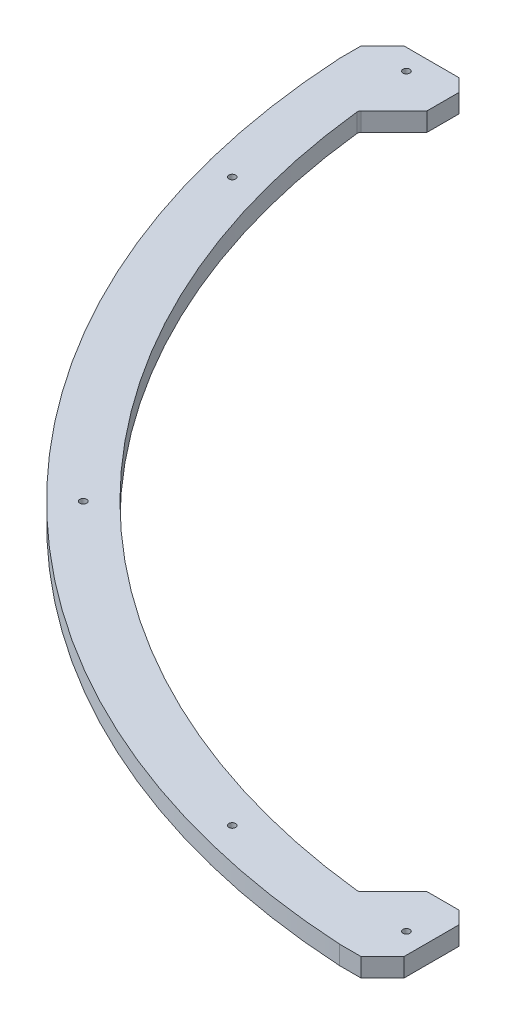
ISO-10303-21;
HEADER;
FILE_DESCRIPTION(('STEP AP214'),'2;1');
FILE_NAME('part.step','',(''),(''),'','','');
FILE_SCHEMA(('AUTOMOTIVE_DESIGN { 1 0 10303 214 1 1 1 1 }'));
ENDSEC;
DATA;
#1=APPLICATION_CONTEXT('core data for automotive mechanical design processes');
#2=APPLICATION_PROTOCOL_DEFINITION('international standard','automotive_design',2000,#1);
#3=PRODUCT_CONTEXT('',#1,'mechanical');
#4=PRODUCT('Part','Part','',(#3));
#5=PRODUCT_RELATED_PRODUCT_CATEGORY('part','',(#4));
#6=PRODUCT_DEFINITION_FORMATION('','',#4);
#7=PRODUCT_DEFINITION_CONTEXT('part definition',#1,'design');
#8=PRODUCT_DEFINITION('design','',#6,#7);
#9=PRODUCT_DEFINITION_SHAPE('','',#8);
#10=(LENGTH_UNIT() NAMED_UNIT(*) SI_UNIT(.MILLI.,.METRE.));
#11=(NAMED_UNIT(*) PLANE_ANGLE_UNIT() SI_UNIT($,.RADIAN.));
#12=(NAMED_UNIT(*) SI_UNIT($,.STERADIAN.) SOLID_ANGLE_UNIT());
#13=UNCERTAINTY_MEASURE_WITH_UNIT(LENGTH_MEASURE(1.E-05),#10,'distance_accuracy_value','');
#14=(GEOMETRIC_REPRESENTATION_CONTEXT(3) GLOBAL_UNCERTAINTY_ASSIGNED_CONTEXT((#13)) GLOBAL_UNIT_ASSIGNED_CONTEXT((#10,
#11,#12)) REPRESENTATION_CONTEXT('',''));
#15=CARTESIAN_POINT('',(0.,0.,0.));
#16=DIRECTION('',(0.,0.,1.));
#17=DIRECTION('',(1.,0.,0.));
#18=AXIS2_PLACEMENT_3D('',#15,#16,#17);
#19=CARTESIAN_POINT('',(0.,18.25625,0.));
#20=DIRECTION('',(0.,-1.,0.));
#21=DIRECTION('',(0.,0.,-1.));
#22=AXIS2_PLACEMENT_3D('',#19,#20,#21);
#23=CYLINDRICAL_SURFACE('',#22,746.125);
#24=CARTESIAN_POINT('',(0.,0.,0.));
#25=DIRECTION('',(0.,1.,0.));
#26=DIRECTION('',(0.,0.,1.));
#27=AXIS2_PLACEMENT_3D('',#24,#25,#26);
#28=CIRCLE('',#27,746.125);
#29=CARTESIAN_POINT('',(-741.694721735866,0.,81.1877784777796));
#30=VERTEX_POINT('',#29);
#31=CARTESIAN_POINT('',(-81.187778477779,0.,741.694721735866));
#32=VERTEX_POINT('',#31);
#33=EDGE_CURVE('E219',#30,#32,#28,.T.);
#34=ORIENTED_EDGE('',*,*,#33,.F.);
#35=DIRECTION('',(0.,-1.,0.));
#36=VECTOR('',#35,1.);
#37=CARTESIAN_POINT('',(-741.694721735866,18.25625,81.1877784777796));
#38=LINE('',#37,#36);
#39=CARTESIAN_POINT('',(-741.694721735866,18.25625,81.1877784777796));
#40=VERTEX_POINT('',#39);
#41=EDGE_CURVE('E237',#30,#40,#38,.F.);
#42=ORIENTED_EDGE('',*,*,#41,.T.);
#43=CARTESIAN_POINT('',(0.,18.25625,0.));
#44=DIRECTION('',(0.,1.,0.));
#45=DIRECTION('',(0.,0.,1.));
#46=AXIS2_PLACEMENT_3D('',#43,#44,#45);
#47=CIRCLE('',#46,746.125);
#48=CARTESIAN_POINT('',(-81.187778477779,18.25625,741.694721735866));
#49=VERTEX_POINT('',#48);
#50=EDGE_CURVE('E220',#40,#49,#47,.T.);
#51=ORIENTED_EDGE('',*,*,#50,.T.);
#52=DIRECTION('',(0.,-1.,0.));
#53=VECTOR('',#52,1.);
#54=CARTESIAN_POINT('',(-81.187778477779,18.25625,741.694721735866));
#55=LINE('',#54,#53);
#56=EDGE_CURVE('E235',#49,#32,#55,.T.);
#57=ORIENTED_EDGE('',*,*,#56,.T.);
#58=EDGE_LOOP('',(#34,#42,#51,#57));
#59=FACE_BOUND('',#58,.T.);
#60=ADVANCED_FACE('F47',(#59),#23,.F.);
#61=CARTESIAN_POINT('',(0.,18.25625,0.));
#62=DIRECTION('',(0.,1.,0.));
#63=DIRECTION('',(0.,0.,1.));
#64=AXIS2_PLACEMENT_3D('',#61,#62,#63);
#65=PLANE('',#64);
#66=DIRECTION('',(1.,0.,0.));
#67=VECTOR('',#66,1.);
#68=CARTESIAN_POINT('',(-774.547090442214,18.25625,2.24506403026717));
#69=LINE('',#68,#67);
#70=CARTESIAN_POINT('',(-774.547090442214,18.25625,2.24506403026717));
#71=VERTEX_POINT('',#70);
#72=CARTESIAN_POINT('',(-720.665553715799,18.25625,2.24506403026716));
#73=VERTEX_POINT('',#72);
#74=EDGE_CURVE('E169',#71,#73,#69,.T.);
#75=ORIENTED_EDGE('',*,*,#74,.F.);
#76=DIRECTION('',(-0.707106781186548,0.,0.707106781186547));
#77=VECTOR('',#76,1.);
#78=CARTESIAN_POINT('',(-949.662084803063,18.25625,177.360058391116));
#79=LINE('',#78,#77);
#80=CARTESIAN_POINT('',(-795.684392912793,18.25625,23.3823665008459));
#81=VERTEX_POINT('',#80);
#82=EDGE_CURVE('E177',#71,#81,#79,.T.);
#83=ORIENTED_EDGE('',*,*,#82,.T.);
#84=DIRECTION('',(0.,0.,-1.));
#85=VECTOR('',#84,1.);
#86=CARTESIAN_POINT('',(-795.684392912793,18.25625,44.45));
#87=LINE('',#86,#85);
#88=CARTESIAN_POINT('',(-795.684392912793,18.25625,44.45));
#89=VERTEX_POINT('',#88);
#90=EDGE_CURVE('E208',#89,#81,#87,.T.);
#91=ORIENTED_EDGE('',*,*,#90,.F.);
#92=CARTESIAN_POINT('',(0.,18.25625,0.));
#93=DIRECTION('',(0.,1.,0.));
#94=DIRECTION('',(0.,0.,1.));
#95=AXIS2_PLACEMENT_3D('',#92,#93,#94);
#96=CIRCLE('',#95,796.925);
#97=CARTESIAN_POINT('',(-44.4499999999999,18.25625,795.684392912793));
#98=VERTEX_POINT('',#97);
#99=EDGE_CURVE('E225',#89,#98,#96,.T.);
#100=ORIENTED_EDGE('',*,*,#99,.T.);
#101=DIRECTION('',(-1.,0.,0.));
#102=VECTOR('',#101,1.);
#103=CARTESIAN_POINT('',(-44.4499999999999,18.25625,795.684392912793));
#104=LINE('',#103,#102);
#105=CARTESIAN_POINT('',(-23.3823665008462,18.25625,795.684392912793));
#106=VERTEX_POINT('',#105);
#107=EDGE_CURVE('E203',#106,#98,#104,.T.);
#108=ORIENTED_EDGE('',*,*,#107,.F.);
#109=DIRECTION('',(0.707106781186547,0.,-0.707106781186548));
#110=VECTOR('',#109,1.);
#111=CARTESIAN_POINT('',(-177.360058391116,18.25625,949.662084803063));
#112=LINE('',#111,#110);
#113=CARTESIAN_POINT('',(-2.24506403026659,18.25625,774.547090442214));
#114=VERTEX_POINT('',#113);
#115=EDGE_CURVE('E183',#106,#114,#112,.T.);
#116=ORIENTED_EDGE('',*,*,#115,.T.);
#117=DIRECTION('',(0.,0.,1.));
#118=VECTOR('',#117,1.);
#119=CARTESIAN_POINT('',(-2.24506403026659,18.25625,774.547090442214));
#120=LINE('',#119,#118);
#121=CARTESIAN_POINT('',(-2.24506403026725,18.25625,720.665553715799));
#122=VERTEX_POINT('',#121);
#123=EDGE_CURVE('E283',#122,#114,#120,.T.);
#124=ORIENTED_EDGE('',*,*,#123,.F.);
#125=DIRECTION('',(-0.707106781186547,0.,-0.707106781186547));
#126=VECTOR('',#125,1.);
#127=CARTESIAN_POINT('',(-747.606322079007,18.25625,-24.6957043329403));
#128=LINE('',#127,#126);
#129=CARTESIAN_POINT('',(-14.5929161967375,18.25625,708.317701549329));
#130=VERTEX_POINT('',#129);
#131=EDGE_CURVE('E275',#122,#130,#128,.T.);
#132=ORIENTED_EDGE('',*,*,#131,.T.);
#133=DIRECTION('',(1.,0.,0.));
#134=VECTOR('',#133,1.);
#135=CARTESIAN_POINT('',(-14.5929161967373,18.25625,708.317701549329));
#136=LINE('',#135,#134);
#137=CARTESIAN_POINT('',(-46.0238126204787,18.25625,708.317701549329));
#138=VERTEX_POINT('',#137);
#139=EDGE_CURVE('E265',#138,#130,#136,.T.);
#140=ORIENTED_EDGE('',*,*,#139,.F.);
#141=DIRECTION('',(-0.707106781186548,0.,0.707106781186547));
#142=VECTOR('',#141,1.);
#143=CARTESIAN_POINT('',(331.146944464425,18.25625,331.146944464425));
#144=LINE('',#143,#142);
#145=CARTESIAN_POINT('',(-78.4314397270201,18.25625,740.72532865587));
#146=VERTEX_POINT('',#145);
#147=EDGE_CURVE('E197',#138,#146,#144,.T.);
#148=ORIENTED_EDGE('',*,*,#147,.T.);
#149=CARTESIAN_POINT('',(-80.8201878552243,18.25625,738.336580527666));
#150=DIRECTION('',(0.,1.,0.));
#151=DIRECTION('',(0.,0.,1.));
#152=AXIS2_PLACEMENT_3D('',#149,#150,#151);
#153=CIRCLE('',#152,3.3782);
#154=EDGE_CURVE('E55',#146,#49,#153,.F.);
#155=ORIENTED_EDGE('',*,*,#154,.T.);
#156=ORIENTED_EDGE('',*,*,#50,.F.);
#157=CARTESIAN_POINT('',(-738.336580527666,18.25625,80.8201878552249));
#158=DIRECTION('',(0.,1.,0.));
#159=DIRECTION('',(0.,0.,1.));
#160=AXIS2_PLACEMENT_3D('',#157,#158,#159);
#161=CIRCLE('',#160,3.3782);
#162=CARTESIAN_POINT('',(-740.72532865587,18.25625,78.4314397270205));
#163=VERTEX_POINT('',#162);
#164=EDGE_CURVE('E244',#40,#163,#161,.F.);
#165=ORIENTED_EDGE('',*,*,#164,.T.);
#166=DIRECTION('',(-0.707106781186546,0.,0.707106781186549));
#167=VECTOR('',#166,1.);
#168=CARTESIAN_POINT('',(-331.146944464427,18.25625,-331.146944464425));
#169=LINE('',#168,#167);
#170=CARTESIAN_POINT('',(-708.317701549329,18.25625,46.0238126204793));
#171=VERTEX_POINT('',#170);
#172=EDGE_CURVE('E198',#171,#163,#169,.T.);
#173=ORIENTED_EDGE('',*,*,#172,.F.);
#174=DIRECTION('',(0.,0.,1.));
#175=VECTOR('',#174,1.);
#176=CARTESIAN_POINT('',(-708.317701549329,18.25625,14.5929161967372));
#177=LINE('',#176,#175);
#178=CARTESIAN_POINT('',(-708.317701549329,18.25625,14.5929161967372));
#179=VERTEX_POINT('',#178);
#180=EDGE_CURVE('E333',#179,#171,#177,.T.);
#181=ORIENTED_EDGE('',*,*,#180,.F.);
#182=EDGE_CURVE('E187',#179,#73,#128,.T.);
#183=ORIENTED_EDGE('',*,*,#182,.T.);
#184=EDGE_LOOP('',(#75,#83,#91,#100,#108,#116,#124,#132,#140,#148,#155,#156,#165,#173,#181,#183));
#185=FACE_BOUND('',#184,.T.);
#186=CARTESIAN_POINT('',(-747.606322079007,18.25625,197.565634663521));
#187=DIRECTION('',(0.,1.,0.));
#188=DIRECTION('',(0.,0.,1.));
#189=AXIS2_PLACEMENT_3D('',#186,#187,#188);
#190=CIRCLE('',#189,3.3782);
#191=CARTESIAN_POINT('',(-747.606322079007,18.25625,200.943834663521));
#192=VERTEX_POINT('',#191);
#193=EDGE_CURVE('E287',#192,#192,#190,.T.);
#194=ORIENTED_EDGE('',*,*,#193,.F.);
#195=EDGE_LOOP('',(#194));
#196=FACE_BOUND('',#195,.T.);
#197=CARTESIAN_POINT('',(-545.550559354951,18.25625,545.550559354951));
#198=DIRECTION('',(0.,1.,0.));
#199=DIRECTION('',(0.,0.,1.));
#200=AXIS2_PLACEMENT_3D('',#197,#198,#199);
#201=CIRCLE('',#200,3.3782);
#202=CARTESIAN_POINT('',(-545.550559354951,18.25625,548.928759354951));
#203=VERTEX_POINT('',#202);
#204=EDGE_CURVE('E293',#203,#203,#201,.T.);
#205=ORIENTED_EDGE('',*,*,#204,.F.);
#206=EDGE_LOOP('',(#205));
#207=FACE_BOUND('',#206,.T.);
#208=CARTESIAN_POINT('',(-197.565634663521,18.25625,747.606322079007));
#209=DIRECTION('',(0.,1.,0.));
#210=DIRECTION('',(0.,0.,1.));
#211=AXIS2_PLACEMENT_3D('',#208,#209,#210);
#212=CIRCLE('',#211,3.3782);
#213=CARTESIAN_POINT('',(-197.565634663521,18.25625,750.984522079007));
#214=VERTEX_POINT('',#213);
#215=EDGE_CURVE('E299',#214,#214,#212,.T.);
#216=ORIENTED_EDGE('',*,*,#215,.F.);
#217=EDGE_LOOP('',(#216));
#218=FACE_BOUND('',#217,.T.);
#219=CARTESIAN_POINT('',(-752.096450139541,18.25625,22.4506403026727));
#220=DIRECTION('',(0.,1.,0.));
#221=DIRECTION('',(0.,0.,1.));
#222=AXIS2_PLACEMENT_3D('',#219,#220,#221);
#223=CIRCLE('',#222,3.3782);
#224=CARTESIAN_POINT('',(-752.096450139541,18.25625,25.8288403026727));
#225=VERTEX_POINT('',#224);
#226=EDGE_CURVE('E305',#225,#225,#223,.T.);
#227=ORIENTED_EDGE('',*,*,#226,.F.);
#228=EDGE_LOOP('',(#227));
#229=FACE_BOUND('',#228,.T.);
#230=CARTESIAN_POINT('',(-22.4506403026727,18.25625,752.096450139541));
#231=DIRECTION('',(0.,1.,0.));
#232=DIRECTION('',(0.,0.,1.));
#233=AXIS2_PLACEMENT_3D('',#230,#231,#232);
#234=CIRCLE('',#233,3.3782);
#235=CARTESIAN_POINT('',(-22.4506403026727,18.25625,755.474650139541));
#236=VERTEX_POINT('',#235);
#237=EDGE_CURVE('E311',#236,#236,#234,.T.);
#238=ORIENTED_EDGE('',*,*,#237,.F.);
#239=EDGE_LOOP('',(#238));
#240=FACE_BOUND('',#239,.T.);
#241=ADVANCED_FACE('F249',(#185,#196,#207,#218,#229,#240),#65,.T.);
#242=CARTESIAN_POINT('',(0.,0.,0.));
#243=DIRECTION('',(0.,1.,0.));
#244=DIRECTION('',(0.,0.,1.));
#245=AXIS2_PLACEMENT_3D('',#242,#243,#244);
#246=PLANE('',#245);
#247=CARTESIAN_POINT('',(-747.606322079007,0.,197.565634663521));
#248=DIRECTION('',(0.,1.,0.));
#249=DIRECTION('',(0.,0.,1.));
#250=AXIS2_PLACEMENT_3D('',#247,#248,#249);
#251=CIRCLE('',#250,3.3782);
#252=CARTESIAN_POINT('',(-747.606322079007,0.,200.943834663521));
#253=VERTEX_POINT('',#252);
#254=EDGE_CURVE('E290',#253,#253,#251,.T.);
#255=ORIENTED_EDGE('',*,*,#254,.T.);
#256=EDGE_LOOP('',(#255));
#257=FACE_BOUND('',#256,.T.);
#258=CARTESIAN_POINT('',(-545.550559354951,0.,545.550559354951));
#259=DIRECTION('',(0.,1.,0.));
#260=DIRECTION('',(0.,0.,1.));
#261=AXIS2_PLACEMENT_3D('',#258,#259,#260);
#262=CIRCLE('',#261,3.3782);
#263=CARTESIAN_POINT('',(-545.550559354951,0.,548.928759354951));
#264=VERTEX_POINT('',#263);
#265=EDGE_CURVE('E296',#264,#264,#262,.T.);
#266=ORIENTED_EDGE('',*,*,#265,.T.);
#267=EDGE_LOOP('',(#266));
#268=FACE_BOUND('',#267,.T.);
#269=CARTESIAN_POINT('',(-197.565634663521,0.,747.606322079007));
#270=DIRECTION('',(0.,1.,0.));
#271=DIRECTION('',(0.,0.,1.));
#272=AXIS2_PLACEMENT_3D('',#269,#270,#271);
#273=CIRCLE('',#272,3.3782);
#274=CARTESIAN_POINT('',(-197.565634663521,0.,750.984522079007));
#275=VERTEX_POINT('',#274);
#276=EDGE_CURVE('E302',#275,#275,#273,.T.);
#277=ORIENTED_EDGE('',*,*,#276,.T.);
#278=EDGE_LOOP('',(#277));
#279=FACE_BOUND('',#278,.T.);
#280=CARTESIAN_POINT('',(-752.096450139541,0.,22.4506403026727));
#281=DIRECTION('',(0.,1.,0.));
#282=DIRECTION('',(0.,0.,1.));
#283=AXIS2_PLACEMENT_3D('',#280,#281,#282);
#284=CIRCLE('',#283,3.3782);
#285=CARTESIAN_POINT('',(-752.096450139541,0.,25.8288403026727));
#286=VERTEX_POINT('',#285);
#287=EDGE_CURVE('E308',#286,#286,#284,.T.);
#288=ORIENTED_EDGE('',*,*,#287,.T.);
#289=EDGE_LOOP('',(#288));
#290=FACE_BOUND('',#289,.T.);
#291=CARTESIAN_POINT('',(-22.4506403026727,0.,752.096450139541));
#292=DIRECTION('',(0.,1.,0.));
#293=DIRECTION('',(0.,0.,1.));
#294=AXIS2_PLACEMENT_3D('',#291,#292,#293);
#295=CIRCLE('',#294,3.3782);
#296=CARTESIAN_POINT('',(-22.4506403026727,0.,755.474650139541));
#297=VERTEX_POINT('',#296);
#298=EDGE_CURVE('E314',#297,#297,#295,.T.);
#299=ORIENTED_EDGE('',*,*,#298,.T.);
#300=EDGE_LOOP('',(#299));
#301=FACE_BOUND('',#300,.T.);
#302=DIRECTION('',(-0.707106781186548,0.,0.707106781186547));
#303=VECTOR('',#302,1.);
#304=CARTESIAN_POINT('',(-949.662084803063,0.,177.360058391116));
#305=LINE('',#304,#303);
#306=CARTESIAN_POINT('',(-774.547090442214,0.,2.24506403026717));
#307=VERTEX_POINT('',#306);
#308=CARTESIAN_POINT('',(-795.684392912793,0.,23.3823665008459));
#309=VERTEX_POINT('',#308);
#310=EDGE_CURVE('E175',#307,#309,#305,.T.);
#311=ORIENTED_EDGE('',*,*,#310,.F.);
#312=DIRECTION('',(1.,0.,0.));
#313=VECTOR('',#312,1.);
#314=CARTESIAN_POINT('',(-774.547090442214,0.,2.24506403026717));
#315=LINE('',#314,#313);
#316=CARTESIAN_POINT('',(-720.665553715799,0.,2.2450640302672));
#317=VERTEX_POINT('',#316);
#318=EDGE_CURVE('E159',#307,#317,#315,.T.);
#319=ORIENTED_EDGE('',*,*,#318,.T.);
#320=DIRECTION('',(-0.707106781186547,0.,-0.707106781186547));
#321=VECTOR('',#320,1.);
#322=CARTESIAN_POINT('',(-747.606322079007,0.,-24.6957043329403));
#323=LINE('',#322,#321);
#324=CARTESIAN_POINT('',(-708.317701549329,0.,14.5929161967373));
#325=VERTEX_POINT('',#324);
#326=EDGE_CURVE('E190',#325,#317,#323,.T.);
#327=ORIENTED_EDGE('',*,*,#326,.F.);
#328=DIRECTION('',(0.,0.,1.));
#329=VECTOR('',#328,1.);
#330=CARTESIAN_POINT('',(-708.317701549329,0.,14.5929161967372));
#331=LINE('',#330,#329);
#332=CARTESIAN_POINT('',(-708.317701549329,0.,46.0238126204793));
#333=VERTEX_POINT('',#332);
#334=EDGE_CURVE('E329',#325,#333,#331,.T.);
#335=ORIENTED_EDGE('',*,*,#334,.T.);
#336=DIRECTION('',(-0.707106781186546,0.,0.707106781186549));
#337=VECTOR('',#336,1.);
#338=CARTESIAN_POINT('',(-331.146944464427,0.,-331.146944464425));
#339=LINE('',#338,#337);
#340=CARTESIAN_POINT('',(-740.72532865587,0.,78.4314397270205));
#341=VERTEX_POINT('',#340);
#342=EDGE_CURVE('E194',#333,#341,#339,.T.);
#343=ORIENTED_EDGE('',*,*,#342,.T.);
#344=CARTESIAN_POINT('',(-738.336580527666,0.,80.8201878552249));
#345=DIRECTION('',(0.,1.,0.));
#346=DIRECTION('',(0.,0.,1.));
#347=AXIS2_PLACEMENT_3D('',#344,#345,#346);
#348=CIRCLE('',#347,3.3782);
#349=EDGE_CURVE('E246',#341,#30,#348,.T.);
#350=ORIENTED_EDGE('',*,*,#349,.T.);
#351=ORIENTED_EDGE('',*,*,#33,.T.);
#352=CARTESIAN_POINT('',(-80.8201878552243,0.,738.336580527666));
#353=DIRECTION('',(0.,1.,0.));
#354=DIRECTION('',(0.,0.,1.));
#355=AXIS2_PLACEMENT_3D('',#352,#353,#354);
#356=CIRCLE('',#355,3.3782);
#357=CARTESIAN_POINT('',(-78.4314397270201,0.,740.72532865587));
#358=VERTEX_POINT('',#357);
#359=EDGE_CURVE('E13',#32,#358,#356,.T.);
#360=ORIENTED_EDGE('',*,*,#359,.T.);
#361=DIRECTION('',(-0.707106781186548,0.,0.707106781186547));
#362=VECTOR('',#361,1.);
#363=CARTESIAN_POINT('',(331.146944464425,0.,331.146944464425));
#364=LINE('',#363,#362);
#365=CARTESIAN_POINT('',(-46.0238126204787,0.,708.317701549329));
#366=VERTEX_POINT('',#365);
#367=EDGE_CURVE('E201',#366,#358,#364,.T.);
#368=ORIENTED_EDGE('',*,*,#367,.F.);
#369=DIRECTION('',(1.,0.,0.));
#370=VECTOR('',#369,1.);
#371=CARTESIAN_POINT('',(-14.5929161967373,0.,708.317701549329));
#372=LINE('',#371,#370);
#373=CARTESIAN_POINT('',(-14.5929161967373,0.,708.317701549329));
#374=VERTEX_POINT('',#373);
#375=EDGE_CURVE('E262',#366,#374,#372,.T.);
#376=ORIENTED_EDGE('',*,*,#375,.T.);
#377=CARTESIAN_POINT('',(-2.24506403026725,0.,720.665553715799));
#378=VERTEX_POINT('',#377);
#379=EDGE_CURVE('E184',#378,#374,#323,.T.);
#380=ORIENTED_EDGE('',*,*,#379,.F.);
#381=DIRECTION('',(0.,0.,1.));
#382=VECTOR('',#381,1.);
#383=CARTESIAN_POINT('',(-2.24506403026659,0.,774.547090442214));
#384=LINE('',#383,#382);
#385=CARTESIAN_POINT('',(-2.24506403026659,0.,774.547090442214));
#386=VERTEX_POINT('',#385);
#387=EDGE_CURVE('E279',#378,#386,#384,.T.);
#388=ORIENTED_EDGE('',*,*,#387,.T.);
#389=DIRECTION('',(0.707106781186547,0.,-0.707106781186548));
#390=VECTOR('',#389,1.);
#391=CARTESIAN_POINT('',(-177.360058391116,0.,949.662084803063));
#392=LINE('',#391,#390);
#393=CARTESIAN_POINT('',(-23.3823665008462,0.,795.684392912793));
#394=VERTEX_POINT('',#393);
#395=EDGE_CURVE('E316',#394,#386,#392,.T.);
#396=ORIENTED_EDGE('',*,*,#395,.F.);
#397=DIRECTION('',(-1.,0.,0.));
#398=VECTOR('',#397,1.);
#399=CARTESIAN_POINT('',(-44.4499999999999,0.,795.684392912793));
#400=LINE('',#399,#398);
#401=CARTESIAN_POINT('',(-44.4499999999999,0.,795.684392912793));
#402=VERTEX_POINT('',#401);
#403=EDGE_CURVE('E211',#394,#402,#400,.T.);
#404=ORIENTED_EDGE('',*,*,#403,.T.);
#405=CARTESIAN_POINT('',(0.,0.,0.));
#406=DIRECTION('',(0.,1.,0.));
#407=DIRECTION('',(0.,0.,1.));
#408=AXIS2_PLACEMENT_3D('',#405,#406,#407);
#409=CIRCLE('',#408,796.925);
#410=CARTESIAN_POINT('',(-795.684392912793,0.,44.45));
#411=VERTEX_POINT('',#410);
#412=EDGE_CURVE('E223',#411,#402,#409,.T.);
#413=ORIENTED_EDGE('',*,*,#412,.F.);
#414=DIRECTION('',(0.,0.,-1.));
#415=VECTOR('',#414,1.);
#416=CARTESIAN_POINT('',(-795.684392912793,0.,44.45));
#417=LINE('',#416,#415);
#418=EDGE_CURVE('E182',#411,#309,#417,.T.);
#419=ORIENTED_EDGE('',*,*,#418,.T.);
#420=EDGE_LOOP('',(#311,#319,#327,#335,#343,#350,#351,#360,#368,#376,#380,#388,#396,#404,#413,#419));
#421=FACE_BOUND('',#420,.T.);
#422=ADVANCED_FACE('F180',(#257,#268,#279,#290,#301,#421),#246,.F.);
#423=CARTESIAN_POINT('',(0.,18.25625,0.));
#424=DIRECTION('',(0.,-1.,0.));
#425=DIRECTION('',(0.,0.,-1.));
#426=AXIS2_PLACEMENT_3D('',#423,#424,#425);
#427=CYLINDRICAL_SURFACE('',#426,796.925);
#428=ORIENTED_EDGE('',*,*,#412,.T.);
#429=DIRECTION('',(0.,-1.,0.));
#430=VECTOR('',#429,1.);
#431=CARTESIAN_POINT('',(-44.4499999999999,18.25625,795.684392912793));
#432=LINE('',#431,#430);
#433=EDGE_CURVE('E207',#402,#98,#432,.F.);
#434=ORIENTED_EDGE('',*,*,#433,.T.);
#435=ORIENTED_EDGE('',*,*,#99,.F.);
#436=DIRECTION('',(0.,-1.,0.));
#437=VECTOR('',#436,1.);
#438=CARTESIAN_POINT('',(-795.684392912793,18.25625,44.45));
#439=LINE('',#438,#437);
#440=EDGE_CURVE('E216',#89,#411,#439,.T.);
#441=ORIENTED_EDGE('',*,*,#440,.T.);
#442=EDGE_LOOP('',(#428,#434,#435,#441));
#443=FACE_BOUND('',#442,.T.);
#444=ADVANCED_FACE('F360',(#443),#427,.T.);
#445=CARTESIAN_POINT('',(-795.684392912793,0.,44.45));
#446=DIRECTION('',(1.,0.,0.));
#447=DIRECTION('',(0.,0.,-1.));
#448=AXIS2_PLACEMENT_3D('',#445,#446,#447);
#449=PLANE('',#448);
#450=ORIENTED_EDGE('',*,*,#90,.T.);
#451=DIRECTION('',(0.,-1.,0.));
#452=VECTOR('',#451,1.);
#453=CARTESIAN_POINT('',(-795.684392912793,0.,23.3823665008458));
#454=LINE('',#453,#452);
#455=EDGE_CURVE('E233',#81,#309,#454,.T.);
#456=ORIENTED_EDGE('',*,*,#455,.T.);
#457=ORIENTED_EDGE('',*,*,#418,.F.);
#458=ORIENTED_EDGE('',*,*,#440,.F.);
#459=EDGE_LOOP('',(#450,#456,#457,#458));
#460=FACE_BOUND('',#459,.T.);
#461=ADVANCED_FACE('F362',(#460),#449,.F.);
#462=CARTESIAN_POINT('',(-44.4499999999999,0.,795.684392912793));
#463=DIRECTION('',(0.,0.,-1.));
#464=DIRECTION('',(-1.,0.,0.));
#465=AXIS2_PLACEMENT_3D('',#462,#463,#464);
#466=PLANE('',#465);
#467=ORIENTED_EDGE('',*,*,#403,.F.);
#468=DIRECTION('',(0.,1.,0.));
#469=VECTOR('',#468,1.);
#470=CARTESIAN_POINT('',(-23.3823665008462,0.,795.684392912793));
#471=LINE('',#470,#469);
#472=EDGE_CURVE('E228',#394,#106,#471,.T.);
#473=ORIENTED_EDGE('',*,*,#472,.T.);
#474=ORIENTED_EDGE('',*,*,#107,.T.);
#475=ORIENTED_EDGE('',*,*,#433,.F.);
#476=EDGE_LOOP('',(#467,#473,#474,#475));
#477=FACE_BOUND('',#476,.T.);
#478=ADVANCED_FACE('F358',(#477),#466,.F.);
#479=CARTESIAN_POINT('',(331.146944464425,0.,331.146944464425));
#480=DIRECTION('',(-0.707106781186547,0.,-0.707106781186548));
#481=DIRECTION('',(-0.707106781186548,0.,0.707106781186547));
#482=AXIS2_PLACEMENT_3D('',#479,#480,#481);
#483=PLANE('',#482);
#484=ORIENTED_EDGE('',*,*,#367,.T.);
#485=DIRECTION('',(0.,1.,0.));
#486=VECTOR('',#485,1.);
#487=CARTESIAN_POINT('',(-78.43143972702,18.25625,740.72532865587));
#488=LINE('',#487,#486);
#489=EDGE_CURVE('E242',#358,#146,#488,.T.);
#490=ORIENTED_EDGE('',*,*,#489,.T.);
#491=ORIENTED_EDGE('',*,*,#147,.F.);
#492=DIRECTION('',(0.,1.,0.));
#493=VECTOR('',#492,1.);
#494=CARTESIAN_POINT('',(-46.0238126204787,0.,708.317701549329));
#495=LINE('',#494,#493);
#496=EDGE_CURVE('E259',#366,#138,#495,.T.);
#497=ORIENTED_EDGE('',*,*,#496,.F.);
#498=EDGE_LOOP('',(#484,#490,#491,#497));
#499=FACE_BOUND('',#498,.T.);
#500=ADVANCED_FACE('F257',(#499),#483,.T.);
#501=CARTESIAN_POINT('',(-331.146944464427,0.,-331.146944464425));
#502=DIRECTION('',(-0.707106781186549,0.,-0.707106781186546));
#503=DIRECTION('',(-0.707106781186546,0.,0.707106781186549));
#504=AXIS2_PLACEMENT_3D('',#501,#502,#503);
#505=PLANE('',#504);
#506=ORIENTED_EDGE('',*,*,#172,.T.);
#507=DIRECTION('',(0.,-1.,0.));
#508=VECTOR('',#507,1.);
#509=CARTESIAN_POINT('',(-740.72532865587,0.,78.4314397270205));
#510=LINE('',#509,#508);
#511=EDGE_CURVE('E240',#163,#341,#510,.T.);
#512=ORIENTED_EDGE('',*,*,#511,.T.);
#513=ORIENTED_EDGE('',*,*,#342,.F.);
#514=DIRECTION('',(0.,1.,0.));
#515=VECTOR('',#514,1.);
#516=CARTESIAN_POINT('',(-708.317701549329,0.,46.0238126204793));
#517=LINE('',#516,#515);
#518=EDGE_CURVE('E338',#333,#171,#517,.T.);
#519=ORIENTED_EDGE('',*,*,#518,.T.);
#520=EDGE_LOOP('',(#506,#512,#513,#519));
#521=FACE_BOUND('',#520,.T.);
#522=ADVANCED_FACE('F337',(#521),#505,.F.);
#523=CARTESIAN_POINT('',(-177.360058391116,18.25625,949.662084803063));
#524=DIRECTION('',(-0.707106781186548,0.,-0.707106781186547));
#525=DIRECTION('',(-0.707106781186547,0.,0.707106781186548));
#526=AXIS2_PLACEMENT_3D('',#523,#524,#525);
#527=PLANE('',#526);
#528=ORIENTED_EDGE('',*,*,#395,.T.);
#529=DIRECTION('',(0.,1.,0.));
#530=VECTOR('',#529,1.);
#531=CARTESIAN_POINT('',(-2.24506403026659,0.,774.547090442214));
#532=LINE('',#531,#530);
#533=EDGE_CURVE('E278',#386,#114,#532,.T.);
#534=ORIENTED_EDGE('',*,*,#533,.T.);
#535=ORIENTED_EDGE('',*,*,#115,.F.);
#536=ORIENTED_EDGE('',*,*,#472,.F.);
#537=EDGE_LOOP('',(#528,#534,#535,#536));
#538=FACE_BOUND('',#537,.T.);
#539=ADVANCED_FACE('F351',(#538),#527,.F.);
#540=CARTESIAN_POINT('',(-949.662084803063,18.25625,177.360058391116));
#541=DIRECTION('',(0.707106781186547,0.,0.707106781186548));
#542=DIRECTION('',(0.707106781186548,0.,-0.707106781186547));
#543=AXIS2_PLACEMENT_3D('',#540,#541,#542);
#544=PLANE('',#543);
#545=ORIENTED_EDGE('',*,*,#82,.F.);
#546=DIRECTION('',(0.,1.,0.));
#547=VECTOR('',#546,1.);
#548=CARTESIAN_POINT('',(-774.547090442214,0.,2.24506403026717));
#549=LINE('',#548,#547);
#550=EDGE_CURVE('E162',#307,#71,#549,.T.);
#551=ORIENTED_EDGE('',*,*,#550,.F.);
#552=ORIENTED_EDGE('',*,*,#310,.T.);
#553=ORIENTED_EDGE('',*,*,#455,.F.);
#554=EDGE_LOOP('',(#545,#551,#552,#553));
#555=FACE_BOUND('',#554,.T.);
#556=ADVANCED_FACE('F173',(#555),#544,.F.);
#557=CARTESIAN_POINT('',(-747.606322079007,18.25625,-24.6957043329403));
#558=DIRECTION('',(-0.707106781186548,0.,0.707106781186548));
#559=DIRECTION('',(0.707106781186548,0.,0.707106781186548));
#560=AXIS2_PLACEMENT_3D('',#557,#558,#559);
#561=PLANE('',#560);
#562=ORIENTED_EDGE('',*,*,#326,.T.);
#563=DIRECTION('',(0.,1.,0.));
#564=VECTOR('',#563,1.);
#565=CARTESIAN_POINT('',(-720.665553715799,0.,2.2450640302672));
#566=LINE('',#565,#564);
#567=EDGE_CURVE('E165',#317,#73,#566,.T.);
#568=ORIENTED_EDGE('',*,*,#567,.T.);
#569=ORIENTED_EDGE('',*,*,#182,.F.);
#570=DIRECTION('',(0.,1.,0.));
#571=VECTOR('',#570,1.);
#572=CARTESIAN_POINT('',(-708.317701549329,0.,14.5929161967372));
#573=LINE('',#572,#571);
#574=EDGE_CURVE('E327',#325,#179,#573,.T.);
#575=ORIENTED_EDGE('',*,*,#574,.F.);
#576=EDGE_LOOP('',(#562,#568,#569,#575));
#577=FACE_BOUND('',#576,.T.);
#578=ADVANCED_FACE('F325',(#577),#561,.F.);
#579=ORIENTED_EDGE('',*,*,#379,.T.);
#580=DIRECTION('',(0.,1.,0.));
#581=VECTOR('',#580,1.);
#582=CARTESIAN_POINT('',(-14.5929161967373,0.,708.317701549329));
#583=LINE('',#582,#581);
#584=EDGE_CURVE('E272',#374,#130,#583,.T.);
#585=ORIENTED_EDGE('',*,*,#584,.T.);
#586=ORIENTED_EDGE('',*,*,#131,.F.);
#587=DIRECTION('',(0.,1.,0.));
#588=VECTOR('',#587,1.);
#589=CARTESIAN_POINT('',(-2.24506403026725,0.,720.665553715799));
#590=LINE('',#589,#588);
#591=EDGE_CURVE('E274',#378,#122,#590,.T.);
#592=ORIENTED_EDGE('',*,*,#591,.F.);
#593=EDGE_LOOP('',(#579,#585,#586,#592));
#594=FACE_BOUND('',#593,.T.);
#595=ADVANCED_FACE('F270',(#594),#561,.F.);
#596=CARTESIAN_POINT('',(-22.4506403026727,18.25625,752.096450139541));
#597=DIRECTION('',(0.,1.,0.));
#598=DIRECTION('',(0.,0.,1.));
#599=AXIS2_PLACEMENT_3D('',#596,#597,#598);
#600=CYLINDRICAL_SURFACE('',#599,3.3782);
#601=ORIENTED_EDGE('',*,*,#298,.F.);
#602=EDGE_LOOP('',(#601));
#603=FACE_BOUND('',#602,.T.);
#604=ORIENTED_EDGE('',*,*,#237,.T.);
#605=EDGE_LOOP('',(#604));
#606=FACE_BOUND('',#605,.T.);
#607=ADVANCED_FACE('F415',(#603,#606),#600,.F.);
#608=CARTESIAN_POINT('',(-752.096450139541,18.25625,22.4506403026727));
#609=DIRECTION('',(0.,1.,0.));
#610=DIRECTION('',(0.,0.,1.));
#611=AXIS2_PLACEMENT_3D('',#608,#609,#610);
#612=CYLINDRICAL_SURFACE('',#611,3.3782);
#613=ORIENTED_EDGE('',*,*,#287,.F.);
#614=EDGE_LOOP('',(#613));
#615=FACE_BOUND('',#614,.T.);
#616=ORIENTED_EDGE('',*,*,#226,.T.);
#617=EDGE_LOOP('',(#616));
#618=FACE_BOUND('',#617,.T.);
#619=ADVANCED_FACE('F411',(#615,#618),#612,.F.);
#620=CARTESIAN_POINT('',(-197.565634663521,18.25625,747.606322079007));
#621=DIRECTION('',(0.,1.,0.));
#622=DIRECTION('',(0.,0.,1.));
#623=AXIS2_PLACEMENT_3D('',#620,#621,#622);
#624=CYLINDRICAL_SURFACE('',#623,3.3782);
#625=ORIENTED_EDGE('',*,*,#276,.F.);
#626=EDGE_LOOP('',(#625));
#627=FACE_BOUND('',#626,.T.);
#628=ORIENTED_EDGE('',*,*,#215,.T.);
#629=EDGE_LOOP('',(#628));
#630=FACE_BOUND('',#629,.T.);
#631=ADVANCED_FACE('F407',(#627,#630),#624,.F.);
#632=CARTESIAN_POINT('',(-545.550559354951,18.25625,545.550559354951));
#633=DIRECTION('',(0.,1.,0.));
#634=DIRECTION('',(0.,0.,1.));
#635=AXIS2_PLACEMENT_3D('',#632,#633,#634);
#636=CYLINDRICAL_SURFACE('',#635,3.3782);
#637=ORIENTED_EDGE('',*,*,#265,.F.);
#638=EDGE_LOOP('',(#637));
#639=FACE_BOUND('',#638,.T.);
#640=ORIENTED_EDGE('',*,*,#204,.T.);
#641=EDGE_LOOP('',(#640));
#642=FACE_BOUND('',#641,.T.);
#643=ADVANCED_FACE('F403',(#639,#642),#636,.F.);
#644=CARTESIAN_POINT('',(-747.606322079007,18.25625,197.565634663521));
#645=DIRECTION('',(0.,1.,0.));
#646=DIRECTION('',(0.,0.,1.));
#647=AXIS2_PLACEMENT_3D('',#644,#645,#646);
#648=CYLINDRICAL_SURFACE('',#647,3.3782);
#649=ORIENTED_EDGE('',*,*,#254,.F.);
#650=EDGE_LOOP('',(#649));
#651=FACE_BOUND('',#650,.T.);
#652=ORIENTED_EDGE('',*,*,#193,.T.);
#653=EDGE_LOOP('',(#652));
#654=FACE_BOUND('',#653,.T.);
#655=ADVANCED_FACE('F400',(#651,#654),#648,.F.);
#656=CARTESIAN_POINT('',(-2.24506403026659,0.,774.547090442214));
#657=DIRECTION('',(-1.,0.,0.));
#658=DIRECTION('',(0.,0.,1.));
#659=AXIS2_PLACEMENT_3D('',#656,#657,#658);
#660=PLANE('',#659);
#661=ORIENTED_EDGE('',*,*,#123,.T.);
#662=ORIENTED_EDGE('',*,*,#533,.F.);
#663=ORIENTED_EDGE('',*,*,#387,.F.);
#664=ORIENTED_EDGE('',*,*,#591,.T.);
#665=EDGE_LOOP('',(#661,#662,#663,#664));
#666=FACE_BOUND('',#665,.T.);
#667=ADVANCED_FACE('F350',(#666),#660,.F.);
#668=CARTESIAN_POINT('',(-14.5929161967373,0.,708.317701549329));
#669=DIRECTION('',(0.,0.,1.));
#670=DIRECTION('',(1.,0.,0.));
#671=AXIS2_PLACEMENT_3D('',#668,#669,#670);
#672=PLANE('',#671);
#673=ORIENTED_EDGE('',*,*,#139,.T.);
#674=ORIENTED_EDGE('',*,*,#584,.F.);
#675=ORIENTED_EDGE('',*,*,#375,.F.);
#676=ORIENTED_EDGE('',*,*,#496,.T.);
#677=EDGE_LOOP('',(#673,#674,#675,#676));
#678=FACE_BOUND('',#677,.T.);
#679=ADVANCED_FACE('F393',(#678),#672,.F.);
#680=CARTESIAN_POINT('',(-708.317701549329,0.,14.5929161967372));
#681=DIRECTION('',(-1.,0.,0.));
#682=DIRECTION('',(0.,0.,1.));
#683=AXIS2_PLACEMENT_3D('',#680,#681,#682);
#684=PLANE('',#683);
#685=ORIENTED_EDGE('',*,*,#180,.T.);
#686=ORIENTED_EDGE('',*,*,#518,.F.);
#687=ORIENTED_EDGE('',*,*,#334,.F.);
#688=ORIENTED_EDGE('',*,*,#574,.T.);
#689=EDGE_LOOP('',(#685,#686,#687,#688));
#690=FACE_BOUND('',#689,.T.);
#691=ADVANCED_FACE('F388',(#690),#684,.F.);
#692=CARTESIAN_POINT('',(-774.547090442214,0.,2.24506403026717));
#693=DIRECTION('',(0.,0.,1.));
#694=DIRECTION('',(1.,0.,0.));
#695=AXIS2_PLACEMENT_3D('',#692,#693,#694);
#696=PLANE('',#695);
#697=ORIENTED_EDGE('',*,*,#74,.T.);
#698=ORIENTED_EDGE('',*,*,#567,.F.);
#699=ORIENTED_EDGE('',*,*,#318,.F.);
#700=ORIENTED_EDGE('',*,*,#550,.T.);
#701=EDGE_LOOP('',(#697,#698,#699,#700));
#702=FACE_BOUND('',#701,.T.);
#703=ADVANCED_FACE('F161',(#702),#696,.F.);
#704=CARTESIAN_POINT('',(-738.336580527666,18.25625,80.8201878552249));
#705=DIRECTION('',(0.,-1.,0.));
#706=DIRECTION('',(0.,0.,-1.));
#707=AXIS2_PLACEMENT_3D('',#704,#705,#706);
#708=CYLINDRICAL_SURFACE('',#707,3.3782);
#709=ORIENTED_EDGE('',*,*,#349,.F.);
#710=ORIENTED_EDGE('',*,*,#511,.F.);
#711=ORIENTED_EDGE('',*,*,#164,.F.);
#712=ORIENTED_EDGE('',*,*,#41,.F.);
#713=EDGE_LOOP('',(#709,#710,#711,#712));
#714=FACE_BOUND('',#713,.T.);
#715=ADVANCED_FACE('F342',(#714),#708,.F.);
#716=CARTESIAN_POINT('',(-80.8201878552243,18.25625,738.336580527666));
#717=DIRECTION('',(0.,-1.,0.));
#718=DIRECTION('',(0.,0.,-1.));
#719=AXIS2_PLACEMENT_3D('',#716,#717,#718);
#720=CYLINDRICAL_SURFACE('',#719,3.3782);
#721=ORIENTED_EDGE('',*,*,#359,.F.);
#722=ORIENTED_EDGE('',*,*,#56,.F.);
#723=ORIENTED_EDGE('',*,*,#154,.F.);
#724=ORIENTED_EDGE('',*,*,#489,.F.);
#725=EDGE_LOOP('',(#721,#722,#723,#724));
#726=FACE_BOUND('',#725,.T.);
#727=ADVANCED_FACE('F49',(#726),#720,.F.);
#728=CLOSED_SHELL('',(#60,#241,#422,#444,#461,#478,#500,#522,#539,#556,#578,#595,#607,#619,#631,
#643,#655,#667,#679,#691,#703,#715,#727));
#729=MANIFOLD_SOLID_BREP('B2',#728);
#730=ADVANCED_BREP_SHAPE_REPRESENTATION('',(#18,#729),#14);
#731=SHAPE_DEFINITION_REPRESENTATION(#9,#730);
ENDSEC;
END-ISO-10303-21;
